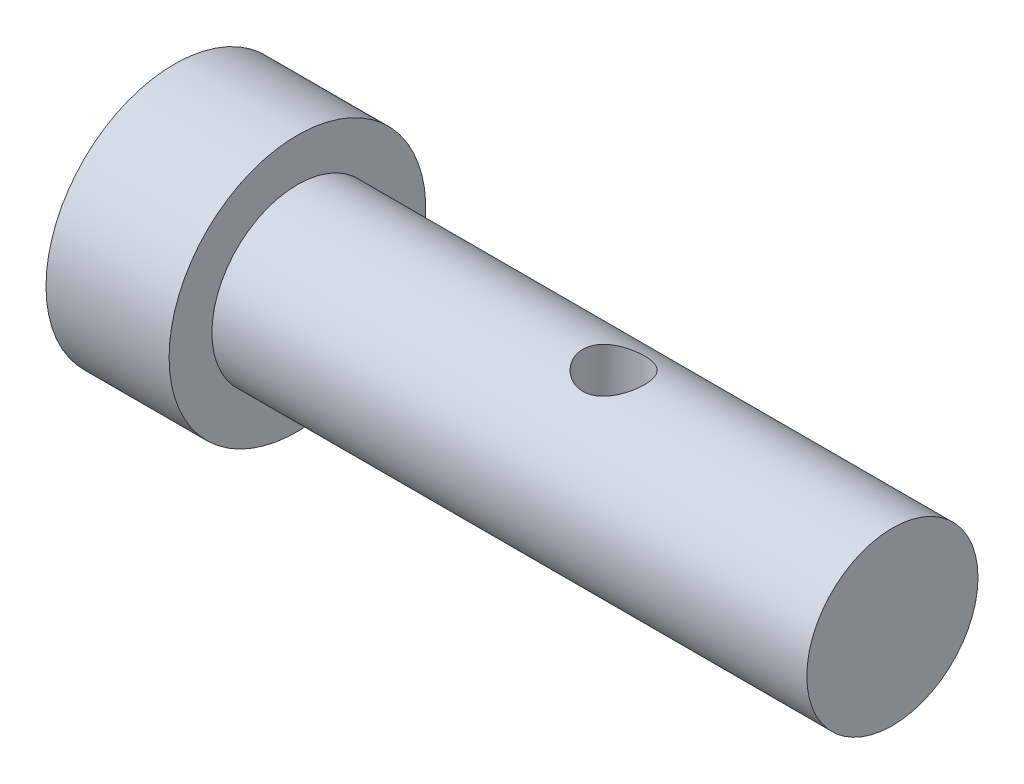
ISO-10303-21;
HEADER;
FILE_DESCRIPTION(('STEP AP214'),'2;1');
FILE_NAME('part.step','',(''),(''),'','','');
FILE_SCHEMA(('AUTOMOTIVE_DESIGN { 1 0 10303 214 1 1 1 1 }'));
ENDSEC;
DATA;
#1=APPLICATION_CONTEXT('core data for automotive mechanical design processes');
#2=APPLICATION_PROTOCOL_DEFINITION('international standard','automotive_design',2000,#1);
#3=PRODUCT_CONTEXT('',#1,'mechanical');
#4=PRODUCT('Part','Part','',(#3));
#5=PRODUCT_RELATED_PRODUCT_CATEGORY('part','',(#4));
#6=PRODUCT_DEFINITION_FORMATION('','',#4);
#7=PRODUCT_DEFINITION_CONTEXT('part definition',#1,'design');
#8=PRODUCT_DEFINITION('design','',#6,#7);
#9=PRODUCT_DEFINITION_SHAPE('','',#8);
#10=(LENGTH_UNIT() NAMED_UNIT(*) SI_UNIT(.MILLI.,.METRE.));
#11=(NAMED_UNIT(*) PLANE_ANGLE_UNIT() SI_UNIT($,.RADIAN.));
#12=(NAMED_UNIT(*) SI_UNIT($,.STERADIAN.) SOLID_ANGLE_UNIT());
#13=UNCERTAINTY_MEASURE_WITH_UNIT(LENGTH_MEASURE(1.E-05),#10,'distance_accuracy_value','');
#14=(GEOMETRIC_REPRESENTATION_CONTEXT(3) GLOBAL_UNCERTAINTY_ASSIGNED_CONTEXT((#13)) GLOBAL_UNIT_ASSIGNED_CONTEXT((#10,
#11,#12)) REPRESENTATION_CONTEXT('',''));
#15=CARTESIAN_POINT('',(0.,0.,0.));
#16=DIRECTION('',(0.,0.,1.));
#17=DIRECTION('',(1.,0.,0.));
#18=AXIS2_PLACEMENT_3D('',#15,#16,#17);
#19=CARTESIAN_POINT('',(-70.,0.,0.));
#20=DIRECTION('',(-1.,0.,0.));
#21=DIRECTION('',(0.,0.,1.));
#22=AXIS2_PLACEMENT_3D('',#19,#20,#21);
#23=CYLINDRICAL_SURFACE('',#22,8.345);
#24=CARTESIAN_POINT('',(-58.,0.,0.));
#25=DIRECTION('',(-1.,0.,0.));
#26=DIRECTION('',(0.,0.,1.));
#27=AXIS2_PLACEMENT_3D('',#24,#25,#26);
#28=CIRCLE('',#27,8.34499999999999);
#29=CARTESIAN_POINT('',(-58.,0.,8.34499999999999));
#30=VERTEX_POINT('',#29);
#31=EDGE_CURVE('E54',#30,#30,#28,.T.);
#32=ORIENTED_EDGE('',*,*,#31,.F.);
#33=EDGE_LOOP('',(#32));
#34=FACE_BOUND('',#33,.T.);
#35=CARTESIAN_POINT('',(0.,0.,0.));
#36=DIRECTION('',(-1.,0.,0.));
#37=DIRECTION('',(0.,0.,1.));
#38=AXIS2_PLACEMENT_3D('',#35,#36,#37);
#39=CIRCLE('',#38,8.345);
#40=CARTESIAN_POINT('',(0.,0.,8.345));
#41=VERTEX_POINT('',#40);
#42=EDGE_CURVE('E10',#41,#41,#39,.T.);
#43=ORIENTED_EDGE('',*,*,#42,.T.);
#44=EDGE_LOOP('',(#43));
#45=FACE_BOUND('',#44,.T.);
#46=CARTESIAN_POINT('',(-27.1809867996878,-7.78710633033863,-3.));
#47=CARTESIAN_POINT('',(-27.018433819003,-7.78710294502758,-3.00000382881113));
#48=CARTESIAN_POINT('',(-26.8559071810601,-7.7922516133011,-2.9867440065925));
#49=CARTESIAN_POINT('',(-26.5357217634878,-7.81216022271854,-2.93427205916195));
#50=CARTESIAN_POINT('',(-26.378063171522,-7.82692053390869,-2.89505893475236));
#51=CARTESIAN_POINT('',(-26.0723165179302,-7.86416901961675,-2.79227864790307));
#52=CARTESIAN_POINT('',(-25.9242080184205,-7.88663999337249,-2.72876565706757));
#53=CARTESIAN_POINT('',(-25.6406938726569,-7.9367512401109,-2.57937807378197));
#54=CARTESIAN_POINT('',(-25.5052917014096,-7.9643929210599,-2.49349738817832));
#55=CARTESIAN_POINT('',(-25.2448586538869,-8.02314406181357,-2.29761693767431));
#56=CARTESIAN_POINT('',(-25.1204902399169,-8.05434976639635,-2.18676503809845));
#57=CARTESIAN_POINT('',(-24.8916474768287,-8.11590601999264,-1.94590090491554));
#58=CARTESIAN_POINT('',(-24.787176944328,-8.14625640399759,-1.81588500392313));
#59=CARTESIAN_POINT('',(-24.5979764179689,-8.20381488051029,-1.53542607150775));
#60=CARTESIAN_POINT('',(-24.5139565098936,-8.23089682962169,-1.38447581498845));
#61=CARTESIAN_POINT('',(-24.3727729738158,-8.27771904658585,-1.06943980905173));
#62=CARTESIAN_POINT('',(-24.3156008398769,-8.29746163928663,-0.905358239217743));
#63=CARTESIAN_POINT('',(-24.232029366769,-8.32669809331481,-0.575674849425506));
#64=CARTESIAN_POINT('',(-24.2044917096879,-8.33656994564461,-0.410395745054666));
#65=CARTESIAN_POINT('',(-24.1773342898048,-8.34630346765119,-0.077287241092945));
#66=CARTESIAN_POINT('',(-24.1777061793338,-8.3461681304512,0.0905413809290322));
#67=CARTESIAN_POINT('',(-24.2056715610866,-8.33614904624699,0.415865301485629));
#68=CARTESIAN_POINT('',(-24.2320250123365,-8.32670937851007,0.57348319422504));
#69=CARTESIAN_POINT('',(-24.3091331349229,-8.29971514785751,0.881888742244213));
#70=CARTESIAN_POINT('',(-24.3598895138783,-8.28216001705766,1.03267591872978));
#71=CARTESIAN_POINT('',(-24.4849940543938,-8.24038161793742,1.32565459272889));
#72=CARTESIAN_POINT('',(-24.5596647600508,-8.21606782156579,1.46769491848229));
#73=CARTESIAN_POINT('',(-24.7302010609476,-8.16325992177473,1.73756992164164));
#74=CARTESIAN_POINT('',(-24.8260731671857,-8.13476453508577,1.86540021695394));
#75=CARTESIAN_POINT('',(-25.0423731766643,-8.07473449628432,2.11056339814803));
#76=CARTESIAN_POINT('',(-25.16385002155,-8.04311882398232,2.22695239780328));
#77=CARTESIAN_POINT('',(-25.4248209517282,-7.98167174310761,2.43804356085939));
#78=CARTESIAN_POINT('',(-25.5643188280694,-7.95184071190374,2.53274114942385));
#79=CARTESIAN_POINT('',(-25.8608104499444,-7.89685478017915,2.69936693767867));
#80=CARTESIAN_POINT('',(-26.0180855739359,-7.87179916943274,2.7708298115476));
#81=CARTESIAN_POINT('',(-26.3435725038742,-7.83034597400539,2.88591287727461));
#82=CARTESIAN_POINT('',(-26.5117787657059,-7.81394403820857,2.92954706386045));
#83=CARTESIAN_POINT('',(-26.8450909569029,-7.79266534597469,2.98567443408574));
#84=CARTESIAN_POINT('',(-27.0099113993405,-7.78723921685537,2.99965382999948));
#85=CARTESIAN_POINT('',(-27.3395965981293,-7.78697843225525,3.00033322122329));
#86=CARTESIAN_POINT('',(-27.5044613365262,-7.79214142631068,2.98703927038792));
#87=CARTESIAN_POINT('',(-27.8222754678605,-7.8119229833268,2.93489270380915));
#88=CARTESIAN_POINT('',(-27.9754340610203,-7.82613318036948,2.89714273313906));
#89=CARTESIAN_POINT('',(-28.2731894117028,-7.86193705668387,2.79851809420484));
#90=CARTESIAN_POINT('',(-28.4177844963127,-7.88353217308141,2.73763892467828));
#91=CARTESIAN_POINT('',(-28.6999945661621,-7.93261585253648,2.59204841245676));
#92=CARTESIAN_POINT('',(-28.8371810744852,-7.96028602724996,2.50656949739833));
#93=CARTESIAN_POINT('',(-29.0957949298188,-8.01807928822132,2.31504245662301));
#94=CARTESIAN_POINT('',(-29.2172169016409,-8.04820320545696,2.20898734568419));
#95=CARTESIAN_POINT('',(-29.448074587509,-8.10959999791785,1.97210569777368));
#96=CARTESIAN_POINT('',(-29.5564223458136,-8.14083958220425,1.84020676136453));
#97=CARTESIAN_POINT('',(-29.7495536757102,-8.19927241102622,1.55932850837524));
#98=CARTESIAN_POINT('',(-29.8343375864008,-8.2264657137877,1.41034943763252));
#99=CARTESIAN_POINT('',(-29.9772710598297,-8.27367435188097,1.09992518860529));
#100=CARTESIAN_POINT('',(-30.0355500381022,-8.29372445888988,0.938545180372587));
#101=CARTESIAN_POINT('',(-30.1238424433871,-8.32452351498094,0.607396063767492));
#102=CARTESIAN_POINT('',(-30.15386795012,-8.33527643889715,0.437630573298257));
#103=CARTESIAN_POINT('',(-30.1835789861018,-8.34592195436579,0.10440567158186));
#104=CARTESIAN_POINT('',(-30.1848158016644,-8.34636982083072,-0.058899017794082));
#105=CARTESIAN_POINT('',(-30.1608417974752,-8.33777157780647,-0.383283967348008));
#106=CARTESIAN_POINT('',(-30.1356337441781,-8.32872646139873,-0.544364458418334));
#107=CARTESIAN_POINT('',(-30.0605560682462,-8.3023942932475,-0.856325393266166));
#108=CARTESIAN_POINT('',(-30.0112139589505,-8.28528380943947,-1.00734880115991));
#109=CARTESIAN_POINT('',(-29.8897786315335,-8.24459312265305,-1.29900516587323));
#110=CARTESIAN_POINT('',(-29.8176811413321,-8.2210117049345,-1.43963616550568));
#111=CARTESIAN_POINT('',(-29.6494578108236,-8.16858268259407,-1.71271645980142));
#112=CARTESIAN_POINT('',(-29.552480200889,-8.13956105293923,-1.84460707716395));
#113=CARTESIAN_POINT('',(-29.3386315488191,-8.07984683987195,-2.09073377551394));
#114=CARTESIAN_POINT('',(-29.2217536652788,-8.04915368429131,-2.20496375919477));
#115=CARTESIAN_POINT('',(-28.9648098659725,-7.98778983496244,-2.41808400996646));
#116=CARTESIAN_POINT('',(-28.8239064930271,-7.9571893942977,-2.51598849114322));
#117=CARTESIAN_POINT('',(-28.5266770424244,-7.90118029952709,-2.68672336430147));
#118=CARTESIAN_POINT('',(-28.3703516787623,-7.87577140523422,-2.75955491638938));
#119=CARTESIAN_POINT('',(-28.0449557961589,-7.83321579641986,-2.8781593512688));
#120=CARTESIAN_POINT('',(-27.8757809113139,-7.81614754715433,-2.92367614547996));
#121=CARTESIAN_POINT('',(-27.5313872893915,-7.79309752353211,-2.9845865670777));
#122=CARTESIAN_POINT('',(-27.3561717465389,-7.78710997872166,-2.99999587365257));
#123=CARTESIAN_POINT('',(-27.1809867996878,-7.78710633033863,-3.));
#124=B_SPLINE_CURVE_WITH_KNOTS('',3,(#46,#47,#48,#49,#50,#51,#52,#53,#54,#55,#56,#57,#58,#59,
#60,#61,#62,#63,#64,#65,#66,#67,#68,#69,#70,#71,#72,#73,#74,#75,#76,#77,#78,#79,#80,#81,#82,#83,
#84,#85,#86,#87,#88,#89,#90,#91,#92,#93,#94,#95,#96,#97,#98,#99,#100,#101,#102,#103,#104,#105,
#106,#107,#108,#109,#110,#111,#112,#113,#114,#115,#116,#117,#118,#119,#120,#121,#122,#123),
.UNSPECIFIED.,.T.,.F.,(4,2,2,2,2,2,2,2,2,2,2,2,2,2,2,2,2,2,2,2,2,2,2,2,2,2,2,2,2,2,2,2,2,2,2,2,
2,2,4),(0.,0.487007971329162,0.97403469347238,1.45998195603453,1.9460617335412,2.45228810701524,
2.95861148232776,3.4805870844101,4.0023972019481,4.50335718934191,5.00416734156985,
5.48217798739261,5.96022208735058,6.44500641147123,6.92993982121985,7.44114481755175,
7.95245753072625,8.47345651136786,8.99419328057243,9.48814768096698,9.98199245035139,
10.454989659013,10.9280789666752,11.4179205984163,11.9079288138464,12.4260613893938,
12.9441865083021,13.4597538789112,13.9751007193346,14.4626096650701,14.9500676165261,
15.4273173121803,15.9046566597212,16.4012464080186,16.8980072221389,17.4183531349237,
17.9386749684396,18.4638017966547,18.9886550796517),.UNSPECIFIED.);
#125=CARTESIAN_POINT('',(-27.1809867996878,-7.78710633033863,-3.));
#126=VERTEX_POINT('',#125);
#127=EDGE_CURVE('E63',#126,#126,#124,.T.);
#128=ORIENTED_EDGE('',*,*,#127,.F.);
#129=EDGE_LOOP('',(#128));
#130=FACE_BOUND('',#129,.T.);
#131=CARTESIAN_POINT('',(-27.1809867996878,7.78710633033863,-3.));
#132=CARTESIAN_POINT('',(-27.3435397803727,7.78710294502758,-3.00000382881113));
#133=CARTESIAN_POINT('',(-27.5060664183156,7.7922516133011,-2.9867440065925));
#134=CARTESIAN_POINT('',(-27.8262518358879,7.81216022271854,-2.93427205916195));
#135=CARTESIAN_POINT('',(-27.9839104278537,7.82692053390869,-2.89505893475236));
#136=CARTESIAN_POINT('',(-28.2896570814455,7.86416901961675,-2.79227864790307));
#137=CARTESIAN_POINT('',(-28.4377655809551,7.88663999337249,-2.72876565706757));
#138=CARTESIAN_POINT('',(-28.7212797267188,7.9367512401109,-2.57937807378197));
#139=CARTESIAN_POINT('',(-28.8566818979661,7.9643929210599,-2.49349738817832));
#140=CARTESIAN_POINT('',(-29.1171149454888,8.02314406181357,-2.29761693767431));
#141=CARTESIAN_POINT('',(-29.2414833594587,8.05434976639635,-2.18676503809845));
#142=CARTESIAN_POINT('',(-29.470326122547,8.11590601999264,-1.94590090491554));
#143=CARTESIAN_POINT('',(-29.5747966550477,8.14625640399759,-1.81588500392313));
#144=CARTESIAN_POINT('',(-29.7639971814067,8.20381488051029,-1.53542607150775));
#145=CARTESIAN_POINT('',(-29.848017089482,8.23089682962169,-1.38447581498845));
#146=CARTESIAN_POINT('',(-29.9892006255599,8.27771904658585,-1.06943980905173));
#147=CARTESIAN_POINT('',(-30.0463727594988,8.29746163928663,-0.905358239217743));
#148=CARTESIAN_POINT('',(-30.1299442326067,8.32669809331481,-0.575674849425506));
#149=CARTESIAN_POINT('',(-30.1574818896878,8.33656994564461,-0.410395745054666));
#150=CARTESIAN_POINT('',(-30.1846393095708,8.34630346765119,-0.077287241092945));
#151=CARTESIAN_POINT('',(-30.1842674200419,8.3461681304512,0.0905413809290322));
#152=CARTESIAN_POINT('',(-30.1563020382891,8.33614904624699,0.415865301485629));
#153=CARTESIAN_POINT('',(-30.1299485870391,8.32670937851007,0.57348319422504));
#154=CARTESIAN_POINT('',(-30.0528404644527,8.29971514785751,0.881888742244213));
#155=CARTESIAN_POINT('',(-30.0020840854974,8.28216001705766,1.03267591872978));
#156=CARTESIAN_POINT('',(-29.8769795449818,8.24038161793742,1.32565459272889));
#157=CARTESIAN_POINT('',(-29.8023088393249,8.21606782156579,1.46769491848229));
#158=CARTESIAN_POINT('',(-29.6317725384281,8.16325992177473,1.73756992164164));
#159=CARTESIAN_POINT('',(-29.53590043219,8.13476453508577,1.86540021695394));
#160=CARTESIAN_POINT('',(-29.3196004227114,8.07473449628432,2.11056339814803));
#161=CARTESIAN_POINT('',(-29.1981235778257,8.04311882398232,2.22695239780328));
#162=CARTESIAN_POINT('',(-28.9371526476475,7.98167174310761,2.43804356085939));
#163=CARTESIAN_POINT('',(-28.7976547713062,7.95184071190374,2.53274114942385));
#164=CARTESIAN_POINT('',(-28.5011631494313,7.89685478017915,2.69936693767867));
#165=CARTESIAN_POINT('',(-28.3438880254398,7.87179916943274,2.7708298115476));
#166=CARTESIAN_POINT('',(-28.0184010955015,7.83034597400539,2.88591287727461));
#167=CARTESIAN_POINT('',(-27.8501948336698,7.81394403820857,2.92954706386045));
#168=CARTESIAN_POINT('',(-27.5168826424727,7.79266534597469,2.98567443408574));
#169=CARTESIAN_POINT('',(-27.3520622000352,7.78723921685537,2.99965382999948));
#170=CARTESIAN_POINT('',(-27.0223770012464,7.78697843225525,3.00033322122329));
#171=CARTESIAN_POINT('',(-26.8575122628495,7.79214142631068,2.98703927038792));
#172=CARTESIAN_POINT('',(-26.5396981315152,7.8119229833268,2.93489270380915));
#173=CARTESIAN_POINT('',(-26.3865395383554,7.82613318036948,2.89714273313906));
#174=CARTESIAN_POINT('',(-26.0887841876729,7.86193705668387,2.79851809420484));
#175=CARTESIAN_POINT('',(-25.9441891030629,7.88353217308141,2.73763892467828));
#176=CARTESIAN_POINT('',(-25.6619790332135,7.93261585253648,2.59204841245676));
#177=CARTESIAN_POINT('',(-25.5247925248904,7.96028602724996,2.50656949739833));
#178=CARTESIAN_POINT('',(-25.2661786695569,8.01807928822132,2.31504245662301));
#179=CARTESIAN_POINT('',(-25.1447566977347,8.04820320545696,2.20898734568419));
#180=CARTESIAN_POINT('',(-24.9138990118667,8.10959999791785,1.97210569777368));
#181=CARTESIAN_POINT('',(-24.8055512535621,8.14083958220425,1.84020676136453));
#182=CARTESIAN_POINT('',(-24.6124199236654,8.19927241102622,1.55932850837524));
#183=CARTESIAN_POINT('',(-24.5276360129748,8.2264657137877,1.41034943763252));
#184=CARTESIAN_POINT('',(-24.384702539546,8.27367435188097,1.09992518860529));
#185=CARTESIAN_POINT('',(-24.3264235612734,8.29372445888988,0.938545180372588));
#186=CARTESIAN_POINT('',(-24.2381311559886,8.32452351498094,0.607396063767493));
#187=CARTESIAN_POINT('',(-24.2081056492556,8.33527643889715,0.437630573298258));
#188=CARTESIAN_POINT('',(-24.1783946132739,8.34592195436579,0.10440567158186));
#189=CARTESIAN_POINT('',(-24.1771577977112,8.34636982083072,-0.0588990177940821));
#190=CARTESIAN_POINT('',(-24.2011318019005,8.33777157780647,-0.383283967348008));
#191=CARTESIAN_POINT('',(-24.2263398551975,8.32872646139873,-0.544364458418333));
#192=CARTESIAN_POINT('',(-24.3014175311295,8.3023942932475,-0.856325393266166));
#193=CARTESIAN_POINT('',(-24.3507596404252,8.28528380943947,-1.00734880115991));
#194=CARTESIAN_POINT('',(-24.4721949678422,8.24459312265305,-1.29900516587323));
#195=CARTESIAN_POINT('',(-24.5442924580435,8.2210117049345,-1.43963616550568));
#196=CARTESIAN_POINT('',(-24.7125157885521,8.16858268259407,-1.71271645980142));
#197=CARTESIAN_POINT('',(-24.8094933984867,8.13956105293923,-1.84460707716395));
#198=CARTESIAN_POINT('',(-25.0233420505566,8.07984683987195,-2.09073377551394));
#199=CARTESIAN_POINT('',(-25.1402199340969,8.04915368429131,-2.20496375919477));
#200=CARTESIAN_POINT('',(-25.3971637334031,7.98778983496244,-2.41808400996646));
#201=CARTESIAN_POINT('',(-25.5380671063486,7.9571893942977,-2.51598849114322));
#202=CARTESIAN_POINT('',(-25.8352965569512,7.90118029952709,-2.68672336430147));
#203=CARTESIAN_POINT('',(-25.9916219206133,7.87577140523422,-2.75955491638938));
#204=CARTESIAN_POINT('',(-26.3170178032168,7.83321579641986,-2.8781593512688));
#205=CARTESIAN_POINT('',(-26.4861926880618,7.81614754715433,-2.92367614547996));
#206=CARTESIAN_POINT('',(-26.8305863099841,7.79309752353211,-2.9845865670777));
#207=CARTESIAN_POINT('',(-27.0058018528367,7.78710997872166,-2.99999587365257));
#208=CARTESIAN_POINT('',(-27.1809867996878,7.78710633033863,-3.));
#209=B_SPLINE_CURVE_WITH_KNOTS('',3,(#131,#132,#133,#134,#135,#136,#137,#138,#139,#140,#141,
#142,#143,#144,#145,#146,#147,#148,#149,#150,#151,#152,#153,#154,#155,#156,#157,#158,#159,#160,
#161,#162,#163,#164,#165,#166,#167,#168,#169,#170,#171,#172,#173,#174,#175,#176,#177,#178,#179,
#180,#181,#182,#183,#184,#185,#186,#187,#188,#189,#190,#191,#192,#193,#194,#195,#196,#197,#198,
#199,#200,#201,#202,#203,#204,#205,#206,#207,#208),.UNSPECIFIED.,.T.,.F.,(4,2,2,2,2,2,2,2,2,2,2,
2,2,2,2,2,2,2,2,2,2,2,2,2,2,2,2,2,2,2,2,2,2,2,2,2,2,2,4),(0.,0.487007971329162,0.97403469347238,
1.45998195603453,1.9460617335412,2.45228810701524,2.95861148232776,3.4805870844101,
4.0023972019481,4.50335718934191,5.00416734156985,5.48217798739261,5.96022208735058,
6.44500641147123,6.92993982121985,7.44114481755175,7.95245753072625,8.47345651136786,
8.99419328057243,9.48814768096699,9.98199245035139,10.454989659013,10.9280789666752,
11.4179205984163,11.9079288138464,12.4260613893938,12.9441865083021,13.4597538789112,
13.9751007193346,14.4626096650701,14.9500676165261,15.4273173121803,15.9046566597212,
16.4012464080186,16.8980072221389,17.4183531349237,17.9386749684396,18.4638017966547,
18.9886550796517),.UNSPECIFIED.);
#210=CARTESIAN_POINT('',(-27.1809867996878,7.78710633033863,-3.));
#211=VERTEX_POINT('',#210);
#212=EDGE_CURVE('E45',#211,#211,#209,.T.);
#213=ORIENTED_EDGE('',*,*,#212,.F.);
#214=EDGE_LOOP('',(#213));
#215=FACE_BOUND('',#214,.T.);
#216=ADVANCED_FACE('F41',(#34,#45,#130,#215),#23,.T.);
#217=CARTESIAN_POINT('',(0.,0.,0.));
#218=DIRECTION('',(-1.,0.,0.));
#219=DIRECTION('',(0.,0.,1.));
#220=AXIS2_PLACEMENT_3D('',#217,#218,#219);
#221=PLANE('',#220);
#222=ORIENTED_EDGE('',*,*,#42,.F.);
#223=EDGE_LOOP('',(#222));
#224=FACE_BOUND('',#223,.T.);
#225=ADVANCED_FACE('F43',(#224),#221,.F.);
#226=CARTESIAN_POINT('',(-58.,0.,-8.34499999999999));
#227=DIRECTION('',(-1.,0.,0.));
#228=DIRECTION('',(0.,0.,1.));
#229=AXIS2_PLACEMENT_3D('',#226,#227,#228);
#230=PLANE('',#229);
#231=CARTESIAN_POINT('',(-58.,0.,0.));
#232=DIRECTION('',(-1.,0.,0.));
#233=DIRECTION('',(0.,0.,1.));
#234=AXIS2_PLACEMENT_3D('',#231,#232,#233);
#235=CIRCLE('',#234,12.5175);
#236=CARTESIAN_POINT('',(-58.,0.,12.5175));
#237=VERTEX_POINT('',#236);
#238=EDGE_CURVE('E60',#237,#237,#235,.T.);
#239=ORIENTED_EDGE('',*,*,#238,.F.);
#240=EDGE_LOOP('',(#239));
#241=FACE_BOUND('',#240,.T.);
#242=ORIENTED_EDGE('',*,*,#31,.T.);
#243=EDGE_LOOP('',(#242));
#244=FACE_BOUND('',#243,.T.);
#245=ADVANCED_FACE('F83',(#241,#244),#230,.F.);
#246=CARTESIAN_POINT('',(-70.,0.,0.));
#247=DIRECTION('',(-1.,0.,0.));
#248=DIRECTION('',(0.,0.,1.));
#249=AXIS2_PLACEMENT_3D('',#246,#247,#248);
#250=CYLINDRICAL_SURFACE('',#249,12.5175);
#251=CARTESIAN_POINT('',(-70.,0.,0.));
#252=DIRECTION('',(-1.,0.,0.));
#253=DIRECTION('',(0.,0.,1.));
#254=AXIS2_PLACEMENT_3D('',#251,#252,#253);
#255=CIRCLE('',#254,12.5175);
#256=CARTESIAN_POINT('',(-70.,0.,12.5175));
#257=VERTEX_POINT('',#256);
#258=EDGE_CURVE('E105',#257,#257,#255,.T.);
#259=ORIENTED_EDGE('',*,*,#258,.F.);
#260=EDGE_LOOP('',(#259));
#261=FACE_BOUND('',#260,.T.);
#262=ORIENTED_EDGE('',*,*,#238,.T.);
#263=EDGE_LOOP('',(#262));
#264=FACE_BOUND('',#263,.T.);
#265=ADVANCED_FACE('F80',(#261,#264),#250,.T.);
#266=CARTESIAN_POINT('',(-70.,0.,-12.5175));
#267=DIRECTION('',(1.,0.,0.));
#268=DIRECTION('',(0.,0.,-1.));
#269=AXIS2_PLACEMENT_3D('',#266,#267,#268);
#270=PLANE('',#269);
#271=ORIENTED_EDGE('',*,*,#258,.T.);
#272=EDGE_LOOP('',(#271));
#273=FACE_BOUND('',#272,.T.);
#274=ADVANCED_FACE('F75',(#273),#270,.F.);
#275=CARTESIAN_POINT('',(-27.1809867996878,12.5175,0.));
#276=DIRECTION('',(0.,-1.,0.));
#277=DIRECTION('',(0.,0.,-1.));
#278=AXIS2_PLACEMENT_3D('',#275,#276,#277);
#279=CYLINDRICAL_SURFACE('',#278,3.);
#280=ORIENTED_EDGE('',*,*,#127,.T.);
#281=EDGE_LOOP('',(#280));
#282=FACE_BOUND('',#281,.T.);
#283=ORIENTED_EDGE('',*,*,#212,.T.);
#284=EDGE_LOOP('',(#283));
#285=FACE_BOUND('',#284,.T.);
#286=ADVANCED_FACE('F71',(#282,#285),#279,.F.);
#287=CLOSED_SHELL('',(#216,#225,#245,#265,#274,#286));
#288=MANIFOLD_SOLID_BREP('B2',#287);
#289=ADVANCED_BREP_SHAPE_REPRESENTATION('',(#18,#288),#14);
#290=SHAPE_DEFINITION_REPRESENTATION(#9,#289);
ENDSEC;
END-ISO-10303-21;
